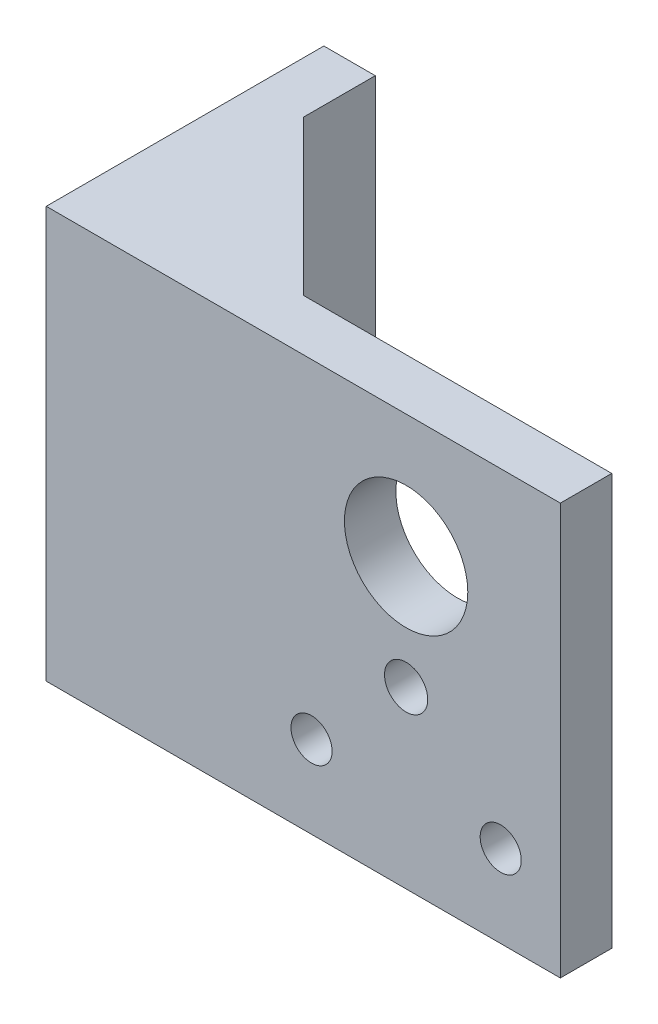
ISO-10303-21;
HEADER;
FILE_DESCRIPTION(('STEP AP214'),'2;1');
FILE_NAME('part.step','',(''),(''),'','','');
FILE_SCHEMA(('AUTOMOTIVE_DESIGN { 1 0 10303 214 1 1 1 1 }'));
ENDSEC;
DATA;
#1=APPLICATION_CONTEXT('core data for automotive mechanical design processes');
#2=APPLICATION_PROTOCOL_DEFINITION('international standard','automotive_design',2000,#1);
#3=PRODUCT_CONTEXT('',#1,'mechanical');
#4=PRODUCT('Part','Part','',(#3));
#5=PRODUCT_RELATED_PRODUCT_CATEGORY('part','',(#4));
#6=PRODUCT_DEFINITION_FORMATION('','',#4);
#7=PRODUCT_DEFINITION_CONTEXT('part definition',#1,'design');
#8=PRODUCT_DEFINITION('design','',#6,#7);
#9=PRODUCT_DEFINITION_SHAPE('','',#8);
#10=(LENGTH_UNIT() NAMED_UNIT(*) SI_UNIT(.MILLI.,.METRE.));
#11=(NAMED_UNIT(*) PLANE_ANGLE_UNIT() SI_UNIT($,.RADIAN.));
#12=(NAMED_UNIT(*) SI_UNIT($,.STERADIAN.) SOLID_ANGLE_UNIT());
#13=UNCERTAINTY_MEASURE_WITH_UNIT(LENGTH_MEASURE(1.E-05),#10,'distance_accuracy_value','');
#14=(GEOMETRIC_REPRESENTATION_CONTEXT(3) GLOBAL_UNCERTAINTY_ASSIGNED_CONTEXT((#13)) GLOBAL_UNIT_ASSIGNED_CONTEXT((#10,
#11,#12)) REPRESENTATION_CONTEXT('',''));
#15=CARTESIAN_POINT('',(0.,0.,0.));
#16=DIRECTION('',(0.,0.,1.));
#17=DIRECTION('',(1.,0.,0.));
#18=AXIS2_PLACEMENT_3D('',#15,#16,#17);
#19=CARTESIAN_POINT('',(50.,40.,-5.00000000000001));
#20=DIRECTION('',(0.,0.,1.));
#21=DIRECTION('',(1.,0.,0.));
#22=AXIS2_PLACEMENT_3D('',#19,#20,#21);
#23=PLANE('',#22);
#24=CARTESIAN_POINT('',(35.,28.,-5.00000000000001));
#25=DIRECTION('',(0.,0.,1.));
#26=DIRECTION('',(1.,0.,0.));
#27=AXIS2_PLACEMENT_3D('',#24,#25,#26);
#28=CIRCLE('',#27,5.99999999999999);
#29=CARTESIAN_POINT('',(41.,28.,-5.00000000000001));
#30=VERTEX_POINT('',#29);
#31=EDGE_CURVE('E424',#30,#30,#28,.T.);
#32=ORIENTED_EDGE('',*,*,#31,.T.);
#33=EDGE_LOOP('',(#32));
#34=FACE_BOUND('',#33,.T.);
#35=CARTESIAN_POINT('',(35.,17.,-5.00000000000001));
#36=DIRECTION('',(0.,0.,-1.));
#37=DIRECTION('',(-1.,0.,0.));
#38=AXIS2_PLACEMENT_3D('',#35,#36,#37);
#39=CIRCLE('',#38,2.1);
#40=CARTESIAN_POINT('',(32.9,17.,-5.00000000000001));
#41=VERTEX_POINT('',#40);
#42=EDGE_CURVE('E156',#41,#41,#39,.T.);
#43=ORIENTED_EDGE('',*,*,#42,.F.);
#44=EDGE_LOOP('',(#43));
#45=FACE_BOUND('',#44,.T.);
#46=CARTESIAN_POINT('',(25.8,8.,-5.00000000000001));
#47=DIRECTION('',(0.,0.,-1.));
#48=DIRECTION('',(-1.,0.,0.));
#49=AXIS2_PLACEMENT_3D('',#46,#47,#48);
#50=CIRCLE('',#49,2.);
#51=CARTESIAN_POINT('',(23.8,8.,-5.00000000000001));
#52=VERTEX_POINT('',#51);
#53=EDGE_CURVE('E428',#52,#52,#50,.T.);
#54=ORIENTED_EDGE('',*,*,#53,.F.);
#55=EDGE_LOOP('',(#54));
#56=FACE_BOUND('',#55,.T.);
#57=CARTESIAN_POINT('',(44.2,8.,-5.00000000000001));
#58=DIRECTION('',(0.,0.,-1.));
#59=DIRECTION('',(-1.,0.,0.));
#60=AXIS2_PLACEMENT_3D('',#57,#58,#59);
#61=CIRCLE('',#60,2.);
#62=CARTESIAN_POINT('',(42.2,8.,-5.00000000000001));
#63=VERTEX_POINT('',#62);
#64=EDGE_CURVE('E425',#63,#63,#61,.T.);
#65=ORIENTED_EDGE('',*,*,#64,.F.);
#66=EDGE_LOOP('',(#65));
#67=FACE_BOUND('',#66,.T.);
#68=DIRECTION('',(0.,-1.,0.));
#69=VECTOR('',#68,1.);
#70=CARTESIAN_POINT('',(20.,5.,-5.00000000000001));
#71=LINE('',#70,#69);
#72=CARTESIAN_POINT('',(20.,5.,-5.00000000000001));
#73=VERTEX_POINT('',#72);
#74=CARTESIAN_POINT('',(20.,0.,-5.00000000000001));
#75=VERTEX_POINT('',#74);
#76=EDGE_CURVE('E59',#73,#75,#71,.T.);
#77=ORIENTED_EDGE('',*,*,#76,.F.);
#78=DIRECTION('',(1.,0.,0.));
#79=VECTOR('',#78,1.);
#80=CARTESIAN_POINT('',(5.,5.,-5.));
#81=LINE('',#80,#79);
#82=CARTESIAN_POINT('',(5.,5.,-5.));
#83=VERTEX_POINT('',#82);
#84=EDGE_CURVE('E174',#83,#73,#81,.T.);
#85=ORIENTED_EDGE('',*,*,#84,.F.);
#86=DIRECTION('',(0.,-1.,0.));
#87=VECTOR('',#86,1.);
#88=CARTESIAN_POINT('',(5.,35.,-5.));
#89=LINE('',#88,#87);
#90=CARTESIAN_POINT('',(5.,35.,-5.));
#91=VERTEX_POINT('',#90);
#92=EDGE_CURVE('E199',#91,#83,#89,.T.);
#93=ORIENTED_EDGE('',*,*,#92,.F.);
#94=DIRECTION('',(1.,0.,0.));
#95=VECTOR('',#94,1.);
#96=CARTESIAN_POINT('',(5.,35.,-5.));
#97=LINE('',#96,#95);
#98=CARTESIAN_POINT('',(20.,35.,-5.00000000000001));
#99=VERTEX_POINT('',#98);
#100=EDGE_CURVE('E194',#91,#99,#97,.T.);
#101=ORIENTED_EDGE('',*,*,#100,.T.);
#102=DIRECTION('',(0.,-1.,0.));
#103=VECTOR('',#102,1.);
#104=CARTESIAN_POINT('',(20.,40.,-5.00000000000001));
#105=LINE('',#104,#103);
#106=CARTESIAN_POINT('',(20.,40.,-5.00000000000001));
#107=VERTEX_POINT('',#106);
#108=EDGE_CURVE('E148',#107,#99,#105,.T.);
#109=ORIENTED_EDGE('',*,*,#108,.F.);
#110=DIRECTION('',(-1.,0.,0.));
#111=VECTOR('',#110,1.);
#112=CARTESIAN_POINT('',(50.,40.,-5.00000000000001));
#113=LINE('',#112,#111);
#114=CARTESIAN_POINT('',(50.,40.,-5.00000000000001));
#115=VERTEX_POINT('',#114);
#116=EDGE_CURVE('E203',#115,#107,#113,.T.);
#117=ORIENTED_EDGE('',*,*,#116,.F.);
#118=DIRECTION('',(0.,-1.,0.));
#119=VECTOR('',#118,1.);
#120=CARTESIAN_POINT('',(50.,40.,-5.00000000000001));
#121=LINE('',#120,#119);
#122=CARTESIAN_POINT('',(50.,0.,-5.00000000000001));
#123=VERTEX_POINT('',#122);
#124=EDGE_CURVE('E43',#115,#123,#121,.T.);
#125=ORIENTED_EDGE('',*,*,#124,.T.);
#126=DIRECTION('',(-1.,0.,0.));
#127=VECTOR('',#126,1.);
#128=CARTESIAN_POINT('',(50.,0.,-5.00000000000001));
#129=LINE('',#128,#127);
#130=EDGE_CURVE('E139',#123,#75,#129,.T.);
#131=ORIENTED_EDGE('',*,*,#130,.T.);
#132=EDGE_LOOP('',(#77,#85,#93,#101,#109,#117,#125,#131));
#133=FACE_BOUND('',#132,.T.);
#134=ADVANCED_FACE('F34',(#34,#45,#56,#67,#133),#23,.F.);
#135=CARTESIAN_POINT('',(5.,40.,-20.));
#136=DIRECTION('',(-1.,0.,0.));
#137=DIRECTION('',(0.,0.,1.));
#138=AXIS2_PLACEMENT_3D('',#135,#136,#137);
#139=PLANE('',#138);
#140=CARTESIAN_POINT('',(5.,20.,-21.));
#141=DIRECTION('',(1.,0.,0.));
#142=DIRECTION('',(0.,0.,-1.));
#143=AXIS2_PLACEMENT_3D('',#140,#141,#142);
#144=CIRCLE('',#143,2.);
#145=CARTESIAN_POINT('',(5.,20.,-23.));
#146=VERTEX_POINT('',#145);
#147=EDGE_CURVE('E439',#146,#146,#144,.T.);
#148=ORIENTED_EDGE('',*,*,#147,.F.);
#149=EDGE_LOOP('',(#148));
#150=FACE_BOUND('',#149,.T.);
#151=CARTESIAN_POINT('',(5.,10.,-13.));
#152=DIRECTION('',(1.,0.,0.));
#153=DIRECTION('',(0.,0.,-1.));
#154=AXIS2_PLACEMENT_3D('',#151,#152,#153);
#155=CIRCLE('',#154,2.);
#156=CARTESIAN_POINT('',(5.,10.,-15.));
#157=VERTEX_POINT('',#156);
#158=EDGE_CURVE('E170',#157,#157,#155,.T.);
#159=ORIENTED_EDGE('',*,*,#158,.F.);
#160=EDGE_LOOP('',(#159));
#161=FACE_BOUND('',#160,.T.);
#162=CARTESIAN_POINT('',(5.,30.,-13.));
#163=DIRECTION('',(1.,0.,0.));
#164=DIRECTION('',(0.,0.,-1.));
#165=AXIS2_PLACEMENT_3D('',#162,#163,#164);
#166=CIRCLE('',#165,2.);
#167=CARTESIAN_POINT('',(5.,30.,-15.));
#168=VERTEX_POINT('',#167);
#169=EDGE_CURVE('E161',#168,#168,#166,.T.);
#170=ORIENTED_EDGE('',*,*,#169,.F.);
#171=EDGE_LOOP('',(#170));
#172=FACE_BOUND('',#171,.T.);
#173=DIRECTION('',(0.,0.,-1.));
#174=VECTOR('',#173,1.);
#175=CARTESIAN_POINT('',(5.,0.,-20.));
#176=LINE('',#175,#174);
#177=CARTESIAN_POINT('',(5.,0.,-20.));
#178=VERTEX_POINT('',#177);
#179=CARTESIAN_POINT('',(5.,0.,-27.));
#180=VERTEX_POINT('',#179);
#181=EDGE_CURVE('E134',#178,#180,#176,.T.);
#182=ORIENTED_EDGE('',*,*,#181,.T.);
#183=DIRECTION('',(0.,-1.,0.));
#184=VECTOR('',#183,1.);
#185=CARTESIAN_POINT('',(5.,40.,-27.));
#186=LINE('',#185,#184);
#187=CARTESIAN_POINT('',(5.,40.,-27.));
#188=VERTEX_POINT('',#187);
#189=EDGE_CURVE('E114',#188,#180,#186,.T.);
#190=ORIENTED_EDGE('',*,*,#189,.F.);
#191=DIRECTION('',(0.,0.,-1.));
#192=VECTOR('',#191,1.);
#193=CARTESIAN_POINT('',(5.,40.,-20.));
#194=LINE('',#193,#192);
#195=CARTESIAN_POINT('',(5.,40.,-20.));
#196=VERTEX_POINT('',#195);
#197=EDGE_CURVE('E208',#196,#188,#194,.T.);
#198=ORIENTED_EDGE('',*,*,#197,.F.);
#199=DIRECTION('',(0.,-1.,0.));
#200=VECTOR('',#199,1.);
#201=CARTESIAN_POINT('',(5.,40.,-20.));
#202=LINE('',#201,#200);
#203=CARTESIAN_POINT('',(5.,35.,-20.));
#204=VERTEX_POINT('',#203);
#205=EDGE_CURVE('E145',#196,#204,#202,.T.);
#206=ORIENTED_EDGE('',*,*,#205,.T.);
#207=DIRECTION('',(0.,0.,1.));
#208=VECTOR('',#207,1.);
#209=CARTESIAN_POINT('',(5.,35.,-20.));
#210=LINE('',#209,#208);
#211=EDGE_CURVE('E191',#204,#91,#210,.T.);
#212=ORIENTED_EDGE('',*,*,#211,.T.);
#213=ORIENTED_EDGE('',*,*,#92,.T.);
#214=DIRECTION('',(0.,0.,1.));
#215=VECTOR('',#214,1.);
#216=CARTESIAN_POINT('',(5.,5.,-20.));
#217=LINE('',#216,#215);
#218=CARTESIAN_POINT('',(5.,5.,-20.));
#219=VERTEX_POINT('',#218);
#220=EDGE_CURVE('E181',#219,#83,#217,.T.);
#221=ORIENTED_EDGE('',*,*,#220,.F.);
#222=DIRECTION('',(0.,-1.,0.));
#223=VECTOR('',#222,1.);
#224=CARTESIAN_POINT('',(5.,5.,-20.));
#225=LINE('',#224,#223);
#226=EDGE_CURVE('E184',#219,#178,#225,.T.);
#227=ORIENTED_EDGE('',*,*,#226,.T.);
#228=EDGE_LOOP('',(#182,#190,#198,#206,#212,#213,#221,#227));
#229=FACE_BOUND('',#228,.T.);
#230=ADVANCED_FACE('F225',(#150,#161,#172,#229),#139,.F.);
#231=CARTESIAN_POINT('',(0.,0.,0.));
#232=DIRECTION('',(0.,1.,0.));
#233=DIRECTION('',(0.,0.,1.));
#234=AXIS2_PLACEMENT_3D('',#231,#232,#233);
#235=PLANE('',#234);
#236=DIRECTION('',(0.,0.,1.));
#237=VECTOR('',#236,1.);
#238=CARTESIAN_POINT('',(0.,0.,-35.));
#239=LINE('',#238,#237);
#240=CARTESIAN_POINT('',(0.,0.,-27.));
#241=VERTEX_POINT('',#240);
#242=CARTESIAN_POINT('',(0.,0.,0.));
#243=VERTEX_POINT('',#242);
#244=EDGE_CURVE('E125',#241,#243,#239,.T.);
#245=ORIENTED_EDGE('',*,*,#244,.F.);
#246=DIRECTION('',(1.,0.,0.));
#247=VECTOR('',#246,1.);
#248=CARTESIAN_POINT('',(0.,0.,-27.));
#249=LINE('',#248,#247);
#250=EDGE_CURVE('E111',#241,#180,#249,.T.);
#251=ORIENTED_EDGE('',*,*,#250,.T.);
#252=ORIENTED_EDGE('',*,*,#181,.F.);
#253=DIRECTION('',(-0.707106781186548,0.,-0.707106781186547));
#254=VECTOR('',#253,1.);
#255=CARTESIAN_POINT('',(20.,0.,-5.00000000000001));
#256=LINE('',#255,#254);
#257=EDGE_CURVE('E178',#75,#178,#256,.T.);
#258=ORIENTED_EDGE('',*,*,#257,.F.);
#259=ORIENTED_EDGE('',*,*,#130,.F.);
#260=DIRECTION('',(0.,0.,-1.));
#261=VECTOR('',#260,1.);
#262=CARTESIAN_POINT('',(50.,0.,0.));
#263=LINE('',#262,#261);
#264=CARTESIAN_POINT('',(50.,0.,0.));
#265=VERTEX_POINT('',#264);
#266=EDGE_CURVE('E213',#265,#123,#263,.T.);
#267=ORIENTED_EDGE('',*,*,#266,.F.);
#268=DIRECTION('',(1.,0.,0.));
#269=VECTOR('',#268,1.);
#270=CARTESIAN_POINT('',(0.,0.,0.));
#271=LINE('',#270,#269);
#272=EDGE_CURVE('E132',#243,#265,#271,.T.);
#273=ORIENTED_EDGE('',*,*,#272,.F.);
#274=EDGE_LOOP('',(#245,#251,#252,#258,#259,#267,#273));
#275=FACE_BOUND('',#274,.T.);
#276=ADVANCED_FACE('F130',(#275),#235,.F.);
#277=CARTESIAN_POINT('',(0.,40.,0.));
#278=DIRECTION('',(0.,0.,-1.));
#279=DIRECTION('',(-1.,0.,0.));
#280=AXIS2_PLACEMENT_3D('',#277,#278,#279);
#281=PLANE('',#280);
#282=CARTESIAN_POINT('',(35.,28.,0.));
#283=DIRECTION('',(0.,0.,1.));
#284=DIRECTION('',(1.,0.,0.));
#285=AXIS2_PLACEMENT_3D('',#282,#283,#284);
#286=CIRCLE('',#285,5.99999999999999);
#287=CARTESIAN_POINT('',(41.,28.,0.));
#288=VERTEX_POINT('',#287);
#289=EDGE_CURVE('E118',#288,#288,#286,.T.);
#290=ORIENTED_EDGE('',*,*,#289,.F.);
#291=EDGE_LOOP('',(#290));
#292=FACE_BOUND('',#291,.T.);
#293=CARTESIAN_POINT('',(35.,17.,0.));
#294=DIRECTION('',(0.,0.,-1.));
#295=DIRECTION('',(-1.,0.,0.));
#296=AXIS2_PLACEMENT_3D('',#293,#294,#295);
#297=CIRCLE('',#296,2.1);
#298=CARTESIAN_POINT('',(32.9,17.,0.));
#299=VERTEX_POINT('',#298);
#300=EDGE_CURVE('E38',#299,#299,#297,.T.);
#301=ORIENTED_EDGE('',*,*,#300,.T.);
#302=EDGE_LOOP('',(#301));
#303=FACE_BOUND('',#302,.T.);
#304=CARTESIAN_POINT('',(25.8,8.,0.));
#305=DIRECTION('',(0.,0.,-1.));
#306=DIRECTION('',(-1.,0.,0.));
#307=AXIS2_PLACEMENT_3D('',#304,#305,#306);
#308=CIRCLE('',#307,2.);
#309=CARTESIAN_POINT('',(23.8,8.,0.));
#310=VERTEX_POINT('',#309);
#311=EDGE_CURVE('E155',#310,#310,#308,.T.);
#312=ORIENTED_EDGE('',*,*,#311,.T.);
#313=EDGE_LOOP('',(#312));
#314=FACE_BOUND('',#313,.T.);
#315=CARTESIAN_POINT('',(44.2,8.,0.));
#316=DIRECTION('',(0.,0.,-1.));
#317=DIRECTION('',(-1.,0.,0.));
#318=AXIS2_PLACEMENT_3D('',#315,#316,#317);
#319=CIRCLE('',#318,2.);
#320=CARTESIAN_POINT('',(42.2,8.,0.));
#321=VERTEX_POINT('',#320);
#322=EDGE_CURVE('E153',#321,#321,#319,.T.);
#323=ORIENTED_EDGE('',*,*,#322,.T.);
#324=EDGE_LOOP('',(#323));
#325=FACE_BOUND('',#324,.T.);
#326=ORIENTED_EDGE('',*,*,#272,.T.);
#327=DIRECTION('',(0.,-1.,0.));
#328=VECTOR('',#327,1.);
#329=CARTESIAN_POINT('',(50.,40.,0.));
#330=LINE('',#329,#328);
#331=CARTESIAN_POINT('',(50.,40.,0.));
#332=VERTEX_POINT('',#331);
#333=EDGE_CURVE('E11',#332,#265,#330,.T.);
#334=ORIENTED_EDGE('',*,*,#333,.F.);
#335=DIRECTION('',(1.,0.,0.));
#336=VECTOR('',#335,1.);
#337=CARTESIAN_POINT('',(0.,40.,0.));
#338=LINE('',#337,#336);
#339=CARTESIAN_POINT('',(0.,40.,0.));
#340=VERTEX_POINT('',#339);
#341=EDGE_CURVE('E133',#340,#332,#338,.T.);
#342=ORIENTED_EDGE('',*,*,#341,.F.);
#343=DIRECTION('',(0.,-1.,0.));
#344=VECTOR('',#343,1.);
#345=CARTESIAN_POINT('',(0.,40.,0.));
#346=LINE('',#345,#344);
#347=EDGE_CURVE('E143',#340,#243,#346,.T.);
#348=ORIENTED_EDGE('',*,*,#347,.T.);
#349=EDGE_LOOP('',(#326,#334,#342,#348));
#350=FACE_BOUND('',#349,.T.);
#351=ADVANCED_FACE('F36',(#292,#303,#314,#325,#350),#281,.F.);
#352=CARTESIAN_POINT('',(50.,40.,0.));
#353=DIRECTION('',(-1.,0.,0.));
#354=DIRECTION('',(0.,0.,1.));
#355=AXIS2_PLACEMENT_3D('',#352,#353,#354);
#356=PLANE('',#355);
#357=ORIENTED_EDGE('',*,*,#266,.T.);
#358=ORIENTED_EDGE('',*,*,#124,.F.);
#359=DIRECTION('',(0.,0.,-1.));
#360=VECTOR('',#359,1.);
#361=CARTESIAN_POINT('',(50.,40.,0.));
#362=LINE('',#361,#360);
#363=EDGE_CURVE('E137',#332,#115,#362,.T.);
#364=ORIENTED_EDGE('',*,*,#363,.F.);
#365=ORIENTED_EDGE('',*,*,#333,.T.);
#366=EDGE_LOOP('',(#357,#358,#364,#365));
#367=FACE_BOUND('',#366,.T.);
#368=ADVANCED_FACE('F239',(#367),#356,.F.);
#369=CARTESIAN_POINT('',(5.,40.,-20.));
#370=DIRECTION('',(0.707106781186547,0.,-0.707106781186548));
#371=DIRECTION('',(-0.707106781186548,0.,-0.707106781186547));
#372=AXIS2_PLACEMENT_3D('',#369,#370,#371);
#373=PLANE('',#372);
#374=DIRECTION('',(0.707106781186548,0.,0.707106781186547));
#375=VECTOR('',#374,1.);
#376=CARTESIAN_POINT('',(5.,35.,-20.));
#377=LINE('',#376,#375);
#378=EDGE_CURVE('E196',#204,#99,#377,.T.);
#379=ORIENTED_EDGE('',*,*,#378,.F.);
#380=ORIENTED_EDGE('',*,*,#205,.F.);
#381=DIRECTION('',(0.707106781186548,0.,0.707106781186547));
#382=VECTOR('',#381,1.);
#383=CARTESIAN_POINT('',(5.,40.,-20.));
#384=LINE('',#383,#382);
#385=EDGE_CURVE('E205',#196,#107,#384,.T.);
#386=ORIENTED_EDGE('',*,*,#385,.T.);
#387=ORIENTED_EDGE('',*,*,#108,.T.);
#388=EDGE_LOOP('',(#379,#380,#386,#387));
#389=FACE_BOUND('',#388,.T.);
#390=ADVANCED_FACE('F231',(#389),#373,.T.);
#391=CARTESIAN_POINT('',(0.,40.,-35.));
#392=DIRECTION('',(1.,0.,0.));
#393=DIRECTION('',(0.,0.,-1.));
#394=AXIS2_PLACEMENT_3D('',#391,#392,#393);
#395=PLANE('',#394);
#396=CARTESIAN_POINT('',(0.,20.,-21.));
#397=DIRECTION('',(1.,0.,0.));
#398=DIRECTION('',(0.,0.,-1.));
#399=AXIS2_PLACEMENT_3D('',#396,#397,#398);
#400=CIRCLE('',#399,2.);
#401=CARTESIAN_POINT('',(0.,20.,-23.));
#402=VERTEX_POINT('',#401);
#403=EDGE_CURVE('E187',#402,#402,#400,.T.);
#404=ORIENTED_EDGE('',*,*,#403,.T.);
#405=EDGE_LOOP('',(#404));
#406=FACE_BOUND('',#405,.T.);
#407=CARTESIAN_POINT('',(0.,10.,-13.));
#408=DIRECTION('',(1.,0.,0.));
#409=DIRECTION('',(0.,0.,-1.));
#410=AXIS2_PLACEMENT_3D('',#407,#408,#409);
#411=CIRCLE('',#410,2.);
#412=CARTESIAN_POINT('',(0.,10.,-15.));
#413=VERTEX_POINT('',#412);
#414=EDGE_CURVE('E442',#413,#413,#411,.T.);
#415=ORIENTED_EDGE('',*,*,#414,.T.);
#416=EDGE_LOOP('',(#415));
#417=FACE_BOUND('',#416,.T.);
#418=CARTESIAN_POINT('',(0.,30.,-13.));
#419=DIRECTION('',(1.,0.,0.));
#420=DIRECTION('',(0.,0.,-1.));
#421=AXIS2_PLACEMENT_3D('',#418,#419,#420);
#422=CIRCLE('',#421,2.);
#423=CARTESIAN_POINT('',(0.,30.,-15.));
#424=VERTEX_POINT('',#423);
#425=EDGE_CURVE('E165',#424,#424,#422,.T.);
#426=ORIENTED_EDGE('',*,*,#425,.T.);
#427=EDGE_LOOP('',(#426));
#428=FACE_BOUND('',#427,.T.);
#429=DIRECTION('',(0.,0.,1.));
#430=VECTOR('',#429,1.);
#431=CARTESIAN_POINT('',(0.,40.,-35.));
#432=LINE('',#431,#430);
#433=CARTESIAN_POINT('',(0.,40.,-27.));
#434=VERTEX_POINT('',#433);
#435=EDGE_CURVE('E127',#434,#340,#432,.T.);
#436=ORIENTED_EDGE('',*,*,#435,.F.);
#437=DIRECTION('',(0.,-1.,0.));
#438=VECTOR('',#437,1.);
#439=CARTESIAN_POINT('',(0.,40.,-27.));
#440=LINE('',#439,#438);
#441=EDGE_CURVE('E51',#434,#241,#440,.T.);
#442=ORIENTED_EDGE('',*,*,#441,.T.);
#443=ORIENTED_EDGE('',*,*,#244,.T.);
#444=ORIENTED_EDGE('',*,*,#347,.F.);
#445=EDGE_LOOP('',(#436,#442,#443,#444));
#446=FACE_BOUND('',#445,.T.);
#447=ADVANCED_FACE('F123',(#406,#417,#428,#446),#395,.F.);
#448=CARTESIAN_POINT('',(0.,40.,0.));
#449=DIRECTION('',(0.,1.,0.));
#450=DIRECTION('',(0.,0.,1.));
#451=AXIS2_PLACEMENT_3D('',#448,#449,#450);
#452=PLANE('',#451);
#453=DIRECTION('',(1.,0.,0.));
#454=VECTOR('',#453,1.);
#455=CARTESIAN_POINT('',(0.,40.,-27.));
#456=LINE('',#455,#454);
#457=EDGE_CURVE('E119',#434,#188,#456,.T.);
#458=ORIENTED_EDGE('',*,*,#457,.F.);
#459=ORIENTED_EDGE('',*,*,#435,.T.);
#460=ORIENTED_EDGE('',*,*,#341,.T.);
#461=ORIENTED_EDGE('',*,*,#363,.T.);
#462=ORIENTED_EDGE('',*,*,#116,.T.);
#463=ORIENTED_EDGE('',*,*,#385,.F.);
#464=ORIENTED_EDGE('',*,*,#197,.T.);
#465=EDGE_LOOP('',(#458,#459,#460,#461,#462,#463,#464));
#466=FACE_BOUND('',#465,.T.);
#467=ADVANCED_FACE('F235',(#466),#452,.T.);
#468=CARTESIAN_POINT('',(0.,35.,0.));
#469=DIRECTION('',(0.,1.,0.));
#470=DIRECTION('',(0.,0.,1.));
#471=AXIS2_PLACEMENT_3D('',#468,#469,#470);
#472=PLANE('',#471);
#473=ORIENTED_EDGE('',*,*,#211,.F.);
#474=ORIENTED_EDGE('',*,*,#378,.T.);
#475=ORIENTED_EDGE('',*,*,#100,.F.);
#476=EDGE_LOOP('',(#473,#474,#475));
#477=FACE_BOUND('',#476,.T.);
#478=ADVANCED_FACE('F229',(#477),#472,.F.);
#479=CARTESIAN_POINT('',(20.,5.,-5.00000000000001));
#480=DIRECTION('',(-0.707106781186547,0.,0.707106781186548));
#481=DIRECTION('',(0.707106781186548,0.,0.707106781186547));
#482=AXIS2_PLACEMENT_3D('',#479,#480,#481);
#483=PLANE('',#482);
#484=ORIENTED_EDGE('',*,*,#257,.T.);
#485=ORIENTED_EDGE('',*,*,#226,.F.);
#486=DIRECTION('',(-0.707106781186548,0.,-0.707106781186547));
#487=VECTOR('',#486,1.);
#488=CARTESIAN_POINT('',(20.,5.,-5.00000000000001));
#489=LINE('',#488,#487);
#490=EDGE_CURVE('E177',#73,#219,#489,.T.);
#491=ORIENTED_EDGE('',*,*,#490,.F.);
#492=ORIENTED_EDGE('',*,*,#76,.T.);
#493=EDGE_LOOP('',(#484,#485,#491,#492));
#494=FACE_BOUND('',#493,.T.);
#495=ADVANCED_FACE('F220',(#494),#483,.F.);
#496=CARTESIAN_POINT('',(0.,5.,0.));
#497=DIRECTION('',(0.,-1.,0.));
#498=DIRECTION('',(0.,0.,-1.));
#499=AXIS2_PLACEMENT_3D('',#496,#497,#498);
#500=PLANE('',#499);
#501=ORIENTED_EDGE('',*,*,#84,.T.);
#502=ORIENTED_EDGE('',*,*,#490,.T.);
#503=ORIENTED_EDGE('',*,*,#220,.T.);
#504=EDGE_LOOP('',(#501,#502,#503));
#505=FACE_BOUND('',#504,.T.);
#506=ADVANCED_FACE('F222',(#505),#500,.F.);
#507=CARTESIAN_POINT('',(0.,30.,-13.));
#508=DIRECTION('',(1.,0.,0.));
#509=DIRECTION('',(0.,0.,-1.));
#510=AXIS2_PLACEMENT_3D('',#507,#508,#509);
#511=CYLINDRICAL_SURFACE('',#510,2.);
#512=ORIENTED_EDGE('',*,*,#425,.F.);
#513=EDGE_LOOP('',(#512));
#514=FACE_BOUND('',#513,.T.);
#515=ORIENTED_EDGE('',*,*,#169,.T.);
#516=EDGE_LOOP('',(#515));
#517=FACE_BOUND('',#516,.T.);
#518=ADVANCED_FACE('F273',(#514,#517),#511,.F.);
#519=CARTESIAN_POINT('',(0.,10.,-13.));
#520=DIRECTION('',(1.,0.,0.));
#521=DIRECTION('',(0.,0.,-1.));
#522=AXIS2_PLACEMENT_3D('',#519,#520,#521);
#523=CYLINDRICAL_SURFACE('',#522,2.);
#524=ORIENTED_EDGE('',*,*,#414,.F.);
#525=EDGE_LOOP('',(#524));
#526=FACE_BOUND('',#525,.T.);
#527=ORIENTED_EDGE('',*,*,#158,.T.);
#528=EDGE_LOOP('',(#527));
#529=FACE_BOUND('',#528,.T.);
#530=ADVANCED_FACE('F276',(#526,#529),#523,.F.);
#531=CARTESIAN_POINT('',(0.,20.,-21.));
#532=DIRECTION('',(1.,0.,0.));
#533=DIRECTION('',(0.,0.,-1.));
#534=AXIS2_PLACEMENT_3D('',#531,#532,#533);
#535=CYLINDRICAL_SURFACE('',#534,2.);
#536=ORIENTED_EDGE('',*,*,#403,.F.);
#537=EDGE_LOOP('',(#536));
#538=FACE_BOUND('',#537,.T.);
#539=ORIENTED_EDGE('',*,*,#147,.T.);
#540=EDGE_LOOP('',(#539));
#541=FACE_BOUND('',#540,.T.);
#542=ADVANCED_FACE('F280',(#538,#541),#535,.F.);
#543=CARTESIAN_POINT('',(44.2,8.,13.4));
#544=DIRECTION('',(0.,0.,-1.));
#545=DIRECTION('',(-1.,0.,0.));
#546=AXIS2_PLACEMENT_3D('',#543,#544,#545);
#547=CYLINDRICAL_SURFACE('',#546,2.);
#548=ORIENTED_EDGE('',*,*,#64,.T.);
#549=EDGE_LOOP('',(#548));
#550=FACE_BOUND('',#549,.T.);
#551=ORIENTED_EDGE('',*,*,#322,.F.);
#552=EDGE_LOOP('',(#551));
#553=FACE_BOUND('',#552,.T.);
#554=ADVANCED_FACE('F284',(#550,#553),#547,.F.);
#555=CARTESIAN_POINT('',(25.8,8.,13.4));
#556=DIRECTION('',(0.,0.,-1.));
#557=DIRECTION('',(-1.,0.,0.));
#558=AXIS2_PLACEMENT_3D('',#555,#556,#557);
#559=CYLINDRICAL_SURFACE('',#558,2.);
#560=ORIENTED_EDGE('',*,*,#53,.T.);
#561=EDGE_LOOP('',(#560));
#562=FACE_BOUND('',#561,.T.);
#563=ORIENTED_EDGE('',*,*,#311,.F.);
#564=EDGE_LOOP('',(#563));
#565=FACE_BOUND('',#564,.T.);
#566=ADVANCED_FACE('F288',(#562,#565),#559,.F.);
#567=CARTESIAN_POINT('',(35.,17.,13.4));
#568=DIRECTION('',(0.,0.,-1.));
#569=DIRECTION('',(-1.,0.,0.));
#570=AXIS2_PLACEMENT_3D('',#567,#568,#569);
#571=CYLINDRICAL_SURFACE('',#570,2.1);
#572=ORIENTED_EDGE('',*,*,#42,.T.);
#573=EDGE_LOOP('',(#572));
#574=FACE_BOUND('',#573,.T.);
#575=ORIENTED_EDGE('',*,*,#300,.F.);
#576=EDGE_LOOP('',(#575));
#577=FACE_BOUND('',#576,.T.);
#578=ADVANCED_FACE('F292',(#574,#577),#571,.F.);
#579=CARTESIAN_POINT('',(35.,28.,-35.));
#580=DIRECTION('',(0.,0.,1.));
#581=DIRECTION('',(1.,0.,0.));
#582=AXIS2_PLACEMENT_3D('',#579,#580,#581);
#583=CYLINDRICAL_SURFACE('',#582,5.99999999999999);
#584=ORIENTED_EDGE('',*,*,#289,.T.);
#585=EDGE_LOOP('',(#584));
#586=FACE_BOUND('',#585,.T.);
#587=ORIENTED_EDGE('',*,*,#31,.F.);
#588=EDGE_LOOP('',(#587));
#589=FACE_BOUND('',#588,.T.);
#590=ADVANCED_FACE('F296',(#586,#589),#583,.F.);
#591=CARTESIAN_POINT('',(0.,40.,-27.));
#592=DIRECTION('',(0.,0.,1.));
#593=DIRECTION('',(0.,-1.,0.));
#594=AXIS2_PLACEMENT_3D('',#591,#592,#593);
#595=PLANE('',#594);
#596=ORIENTED_EDGE('',*,*,#189,.T.);
#597=ORIENTED_EDGE('',*,*,#250,.F.);
#598=ORIENTED_EDGE('',*,*,#441,.F.);
#599=ORIENTED_EDGE('',*,*,#457,.T.);
#600=EDGE_LOOP('',(#596,#597,#598,#599));
#601=FACE_BOUND('',#600,.T.);
#602=ADVANCED_FACE('F112',(#601),#595,.F.);
#603=CLOSED_SHELL('',(#134,#230,#276,#351,#368,#390,#447,#467,#478,#495,#506,#518,#530,#542,
#554,#566,#578,#590,#602));
#604=MANIFOLD_SOLID_BREP('B2',#603);
#605=ADVANCED_BREP_SHAPE_REPRESENTATION('',(#18,#604),#14);
#606=SHAPE_DEFINITION_REPRESENTATION(#9,#605);
ENDSEC;
END-ISO-10303-21;
